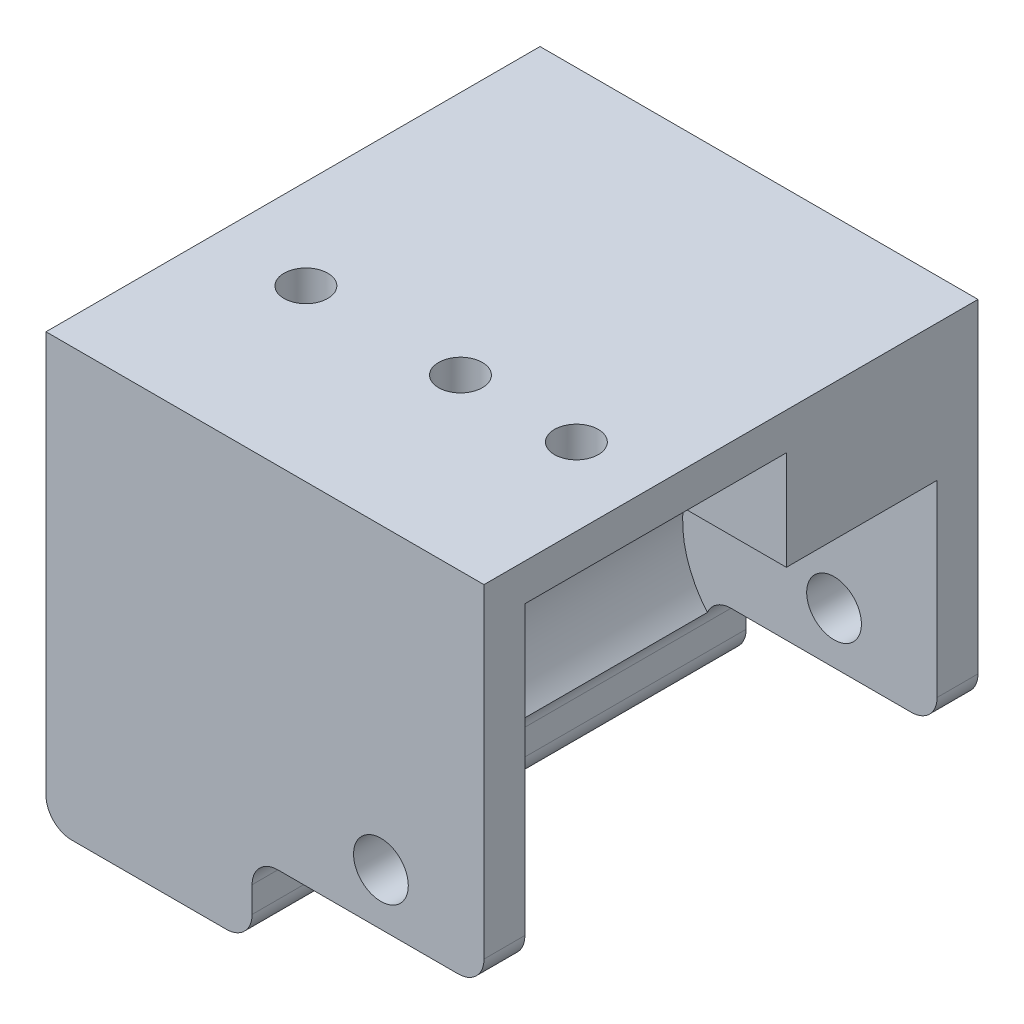
ISO-10303-21;
HEADER;
FILE_DESCRIPTION(('STEP AP214'),'2;1');
FILE_NAME('part.step','',(''),(''),'','','');
FILE_SCHEMA(('AUTOMOTIVE_DESIGN { 1 0 10303 214 1 1 1 1 }'));
ENDSEC;
DATA;
#1=APPLICATION_CONTEXT('core data for automotive mechanical design processes');
#2=APPLICATION_PROTOCOL_DEFINITION('international standard','automotive_design',2000,#1);
#3=PRODUCT_CONTEXT('',#1,'mechanical');
#4=PRODUCT('Part','Part','',(#3));
#5=PRODUCT_RELATED_PRODUCT_CATEGORY('part','',(#4));
#6=PRODUCT_DEFINITION_FORMATION('','',#4);
#7=PRODUCT_DEFINITION_CONTEXT('part definition',#1,'design');
#8=PRODUCT_DEFINITION('design','',#6,#7);
#9=PRODUCT_DEFINITION_SHAPE('','',#8);
#10=(LENGTH_UNIT() NAMED_UNIT(*) SI_UNIT(.MILLI.,.METRE.));
#11=(NAMED_UNIT(*) PLANE_ANGLE_UNIT() SI_UNIT($,.RADIAN.));
#12=(NAMED_UNIT(*) SI_UNIT($,.STERADIAN.) SOLID_ANGLE_UNIT());
#13=UNCERTAINTY_MEASURE_WITH_UNIT(LENGTH_MEASURE(1.E-05),#10,'distance_accuracy_value','');
#14=(GEOMETRIC_REPRESENTATION_CONTEXT(3) GLOBAL_UNCERTAINTY_ASSIGNED_CONTEXT((#13)) GLOBAL_UNIT_ASSIGNED_CONTEXT((#10,
#11,#12)) REPRESENTATION_CONTEXT('',''));
#15=CARTESIAN_POINT('',(0.,0.,0.));
#16=DIRECTION('',(0.,0.,1.));
#17=DIRECTION('',(1.,0.,0.));
#18=AXIS2_PLACEMENT_3D('',#15,#16,#17);
#19=CARTESIAN_POINT('',(0.,0.,-32.));
#20=DIRECTION('',(0.,0.,-1.));
#21=DIRECTION('',(1.,0.,0.));
#22=AXIS2_PLACEMENT_3D('',#19,#20,#21);
#23=PLANE('',#22);
#24=CARTESIAN_POINT('',(-8.,4.,-32.));
#25=DIRECTION('',(0.,0.,1.));
#26=DIRECTION('',(1.,0.,0.));
#27=AXIS2_PLACEMENT_3D('',#24,#25,#26);
#28=CIRCLE('',#27,2.125);
#29=CARTESIAN_POINT('',(-5.875,4.,-32.));
#30=VERTEX_POINT('',#29);
#31=EDGE_CURVE('E264',#30,#30,#28,.T.);
#32=ORIENTED_EDGE('',*,*,#31,.F.);
#33=EDGE_LOOP('',(#32));
#34=FACE_BOUND('',#33,.T.);
#35=DIRECTION('',(1.,0.,0.));
#36=VECTOR('',#35,1.);
#37=CARTESIAN_POINT('',(0.,0.,-32.));
#38=LINE('',#37,#36);
#39=CARTESIAN_POINT('',(-16.,0.,-32.));
#40=VERTEX_POINT('',#39);
#41=CARTESIAN_POINT('',(-2.,0.,-32.));
#42=VERTEX_POINT('',#41);
#43=EDGE_CURVE('E280',#40,#42,#38,.T.);
#44=ORIENTED_EDGE('',*,*,#43,.T.);
#45=CARTESIAN_POINT('',(-2.,2.,-32.));
#46=DIRECTION('',(0.,0.,-1.));
#47=DIRECTION('',(-1.,0.,0.));
#48=AXIS2_PLACEMENT_3D('',#45,#46,#47);
#49=CIRCLE('',#48,2.);
#50=CARTESIAN_POINT('',(0.,2.,-32.));
#51=VERTEX_POINT('',#50);
#52=EDGE_CURVE('E373',#42,#51,#49,.F.);
#53=ORIENTED_EDGE('',*,*,#52,.T.);
#54=DIRECTION('',(0.,1.,0.));
#55=VECTOR('',#54,1.);
#56=CARTESIAN_POINT('',(0.,0.,-32.));
#57=LINE('',#56,#55);
#58=CARTESIAN_POINT('',(0.,16.6,-32.));
#59=VERTEX_POINT('',#58);
#60=EDGE_CURVE('E271',#51,#59,#57,.T.);
#61=ORIENTED_EDGE('',*,*,#60,.T.);
#62=DIRECTION('',(1.,0.,0.));
#63=VECTOR('',#62,1.);
#64=CARTESIAN_POINT('',(-34.,16.6,-32.));
#65=LINE('',#64,#63);
#66=CARTESIAN_POINT('',(-18.,16.6,-32.));
#67=VERTEX_POINT('',#66);
#68=EDGE_CURVE('E200',#67,#59,#65,.T.);
#69=ORIENTED_EDGE('',*,*,#68,.F.);
#70=DIRECTION('',(0.,-1.,0.));
#71=VECTOR('',#70,1.);
#72=CARTESIAN_POINT('',(-18.,9.,-32.));
#73=LINE('',#72,#71);
#74=CARTESIAN_POINT('',(-18.,9.,-32.));
#75=VERTEX_POINT('',#74);
#76=EDGE_CURVE('E254',#67,#75,#73,.T.);
#77=ORIENTED_EDGE('',*,*,#76,.T.);
#78=CARTESIAN_POINT('',(-11.7550020016016,4.,-32.));
#79=DIRECTION('',(0.,0.,-1.));
#80=DIRECTION('',(-1.,0.,0.));
#81=AXIS2_PLACEMENT_3D('',#78,#79,#80);
#82=CIRCLE('',#81,8.);
#83=CARTESIAN_POINT('',(-17.8335182833445,-1.20111909232879,-32.));
#84=VERTEX_POINT('',#83);
#85=EDGE_CURVE('E63',#75,#84,#82,.F.);
#86=ORIENTED_EDGE('',*,*,#85,.T.);
#87=CARTESIAN_POINT('',(-16.,-2.,-32.));
#88=DIRECTION('',(0.,0.,-1.));
#89=DIRECTION('',(-1.,0.,0.));
#90=AXIS2_PLACEMENT_3D('',#87,#88,#89);
#91=CIRCLE('',#90,2.);
#92=EDGE_CURVE('E420',#84,#40,#91,.T.);
#93=ORIENTED_EDGE('',*,*,#92,.T.);
#94=EDGE_LOOP('',(#44,#53,#61,#69,#77,#86,#93));
#95=FACE_BOUND('',#94,.T.);
#96=ADVANCED_FACE('F45',(#34,#95),#23,.F.);
#97=CARTESIAN_POINT('',(0.,0.,0.));
#98=DIRECTION('',(0.,0.,1.));
#99=DIRECTION('',(1.,0.,0.));
#100=AXIS2_PLACEMENT_3D('',#97,#98,#99);
#101=PLANE('',#100);
#102=CARTESIAN_POINT('',(-8.,4.,0.));
#103=DIRECTION('',(0.,0.,1.));
#104=DIRECTION('',(1.,0.,0.));
#105=AXIS2_PLACEMENT_3D('',#102,#103,#104);
#106=CIRCLE('',#105,2.125);
#107=CARTESIAN_POINT('',(-5.875,4.,0.));
#108=VERTEX_POINT('',#107);
#109=EDGE_CURVE('E315',#108,#108,#106,.T.);
#110=ORIENTED_EDGE('',*,*,#109,.T.);
#111=EDGE_LOOP('',(#110));
#112=FACE_BOUND('',#111,.T.);
#113=DIRECTION('',(0.,1.,0.));
#114=VECTOR('',#113,1.);
#115=CARTESIAN_POINT('',(0.,0.,0.));
#116=LINE('',#115,#114);
#117=CARTESIAN_POINT('',(0.,2.,0.));
#118=VERTEX_POINT('',#117);
#119=CARTESIAN_POINT('',(0.,24.3,0.));
#120=VERTEX_POINT('',#119);
#121=EDGE_CURVE('E320',#118,#120,#116,.T.);
#122=ORIENTED_EDGE('',*,*,#121,.F.);
#123=CARTESIAN_POINT('',(-2.,2.,0.));
#124=DIRECTION('',(0.,0.,1.));
#125=DIRECTION('',(1.,0.,0.));
#126=AXIS2_PLACEMENT_3D('',#123,#124,#125);
#127=CIRCLE('',#126,2.);
#128=CARTESIAN_POINT('',(-2.,0.,0.));
#129=VERTEX_POINT('',#128);
#130=EDGE_CURVE('E392',#118,#129,#127,.F.);
#131=ORIENTED_EDGE('',*,*,#130,.T.);
#132=DIRECTION('',(1.,0.,0.));
#133=VECTOR('',#132,1.);
#134=CARTESIAN_POINT('',(0.,0.,0.));
#135=LINE('',#134,#133);
#136=CARTESIAN_POINT('',(-16.,0.,0.));
#137=VERTEX_POINT('',#136);
#138=EDGE_CURVE('E328',#137,#129,#135,.T.);
#139=ORIENTED_EDGE('',*,*,#138,.F.);
#140=CARTESIAN_POINT('',(-16.,-2.,0.));
#141=DIRECTION('',(0.,0.,1.));
#142=DIRECTION('',(1.,0.,0.));
#143=AXIS2_PLACEMENT_3D('',#140,#141,#142);
#144=CIRCLE('',#143,2.);
#145=CARTESIAN_POINT('',(-17.8335182833445,-1.20111909232879,0.));
#146=VERTEX_POINT('',#145);
#147=EDGE_CURVE('E414',#137,#146,#144,.T.);
#148=ORIENTED_EDGE('',*,*,#147,.T.);
#149=CARTESIAN_POINT('',(-11.7550020016016,4.,0.));
#150=DIRECTION('',(0.,0.,1.));
#151=DIRECTION('',(-1.,0.,0.));
#152=AXIS2_PLACEMENT_3D('',#149,#150,#151);
#153=CIRCLE('',#152,8.);
#154=CARTESIAN_POINT('',(-18.,9.,0.));
#155=VERTEX_POINT('',#154);
#156=EDGE_CURVE('E70',#155,#146,#153,.T.);
#157=ORIENTED_EDGE('',*,*,#156,.F.);
#158=DIRECTION('',(0.,-1.,0.));
#159=VECTOR('',#158,1.);
#160=CARTESIAN_POINT('',(-18.,9.,0.));
#161=LINE('',#160,#159);
#162=CARTESIAN_POINT('',(-18.,16.6,0.));
#163=VERTEX_POINT('',#162);
#164=EDGE_CURVE('E245',#163,#155,#161,.T.);
#165=ORIENTED_EDGE('',*,*,#164,.F.);
#166=DIRECTION('',(1.,0.,0.));
#167=VECTOR('',#166,1.);
#168=CARTESIAN_POINT('',(-18.,16.6,0.));
#169=LINE('',#168,#167);
#170=CARTESIAN_POINT('',(-34.,16.6,0.));
#171=VERTEX_POINT('',#170);
#172=EDGE_CURVE('E241',#171,#163,#169,.T.);
#173=ORIENTED_EDGE('',*,*,#172,.F.);
#174=DIRECTION('',(0.,-1.,0.));
#175=VECTOR('',#174,1.);
#176=CARTESIAN_POINT('',(-34.,0.,0.));
#177=LINE('',#176,#175);
#178=CARTESIAN_POINT('',(-34.,24.3,0.));
#179=VERTEX_POINT('',#178);
#180=EDGE_CURVE('E347',#179,#171,#177,.T.);
#181=ORIENTED_EDGE('',*,*,#180,.F.);
#182=DIRECTION('',(-1.,0.,0.));
#183=VECTOR('',#182,1.);
#184=CARTESIAN_POINT('',(0.,24.3,0.));
#185=LINE('',#184,#183);
#186=EDGE_CURVE('E216',#120,#179,#185,.T.);
#187=ORIENTED_EDGE('',*,*,#186,.F.);
#188=EDGE_LOOP('',(#122,#131,#139,#148,#157,#165,#173,#181,#187));
#189=FACE_BOUND('',#188,.T.);
#190=ADVANCED_FACE('F500',(#112,#189),#101,.F.);
#191=CARTESIAN_POINT('',(0.,0.,3.175));
#192=DIRECTION('',(0.,0.,1.));
#193=DIRECTION('',(1.,0.,0.));
#194=AXIS2_PLACEMENT_3D('',#191,#192,#193);
#195=PLANE('',#194);
#196=DIRECTION('',(1.,0.,0.));
#197=VECTOR('',#196,1.);
#198=CARTESIAN_POINT('',(0.,0.,3.175));
#199=LINE('',#198,#197);
#200=CARTESIAN_POINT('',(-16.,0.,3.175));
#201=VERTEX_POINT('',#200);
#202=CARTESIAN_POINT('',(-2.,0.,3.175));
#203=VERTEX_POINT('',#202);
#204=EDGE_CURVE('E340',#201,#203,#199,.T.);
#205=ORIENTED_EDGE('',*,*,#204,.T.);
#206=CARTESIAN_POINT('',(-2.,2.,3.175));
#207=DIRECTION('',(0.,0.,1.));
#208=DIRECTION('',(1.,0.,0.));
#209=AXIS2_PLACEMENT_3D('',#206,#207,#208);
#210=CIRCLE('',#209,2.);
#211=CARTESIAN_POINT('',(0.,2.,3.175));
#212=VERTEX_POINT('',#211);
#213=EDGE_CURVE('E401',#203,#212,#210,.T.);
#214=ORIENTED_EDGE('',*,*,#213,.T.);
#215=DIRECTION('',(0.,1.,0.));
#216=VECTOR('',#215,1.);
#217=CARTESIAN_POINT('',(0.,0.,3.175));
#218=LINE('',#217,#216);
#219=CARTESIAN_POINT('',(0.,27.175,3.175));
#220=VERTEX_POINT('',#219);
#221=EDGE_CURVE('E324',#212,#220,#218,.T.);
#222=ORIENTED_EDGE('',*,*,#221,.T.);
#223=DIRECTION('',(1.,0.,0.));
#224=VECTOR('',#223,1.);
#225=CARTESIAN_POINT('',(-34.,27.175,3.175));
#226=LINE('',#225,#224);
#227=CARTESIAN_POINT('',(-34.,27.175,3.175));
#228=VERTEX_POINT('',#227);
#229=EDGE_CURVE('E297',#228,#220,#226,.T.);
#230=ORIENTED_EDGE('',*,*,#229,.F.);
#231=DIRECTION('',(0.,-1.,0.));
#232=VECTOR('',#231,1.);
#233=CARTESIAN_POINT('',(-34.,0.,3.175));
#234=LINE('',#233,#232);
#235=CARTESIAN_POINT('',(-34.,-4.,3.175));
#236=VERTEX_POINT('',#235);
#237=EDGE_CURVE('E327',#228,#236,#234,.T.);
#238=ORIENTED_EDGE('',*,*,#237,.T.);
#239=CARTESIAN_POINT('',(-32.,-4.,3.175));
#240=DIRECTION('',(0.,0.,1.));
#241=DIRECTION('',(1.,0.,0.));
#242=AXIS2_PLACEMENT_3D('',#239,#240,#241);
#243=CIRCLE('',#242,2.);
#244=CARTESIAN_POINT('',(-32.,-6.,3.175));
#245=VERTEX_POINT('',#244);
#246=EDGE_CURVE('E398',#236,#245,#243,.T.);
#247=ORIENTED_EDGE('',*,*,#246,.T.);
#248=DIRECTION('',(1.,0.,0.));
#249=VECTOR('',#248,1.);
#250=CARTESIAN_POINT('',(-34.,-6.,3.175));
#251=LINE('',#250,#249);
#252=CARTESIAN_POINT('',(-20.,-6.,3.175));
#253=VERTEX_POINT('',#252);
#254=EDGE_CURVE('E332',#245,#253,#251,.T.);
#255=ORIENTED_EDGE('',*,*,#254,.T.);
#256=CARTESIAN_POINT('',(-20.,-4.,3.175));
#257=DIRECTION('',(0.,0.,1.));
#258=DIRECTION('',(1.,0.,0.));
#259=AXIS2_PLACEMENT_3D('',#256,#257,#258);
#260=CIRCLE('',#259,2.);
#261=CARTESIAN_POINT('',(-18.,-4.,3.175));
#262=VERTEX_POINT('',#261);
#263=EDGE_CURVE('E395',#253,#262,#260,.T.);
#264=ORIENTED_EDGE('',*,*,#263,.T.);
#265=DIRECTION('',(0.,1.,0.));
#266=VECTOR('',#265,1.);
#267=CARTESIAN_POINT('',(-18.,0.,3.175));
#268=LINE('',#267,#266);
#269=CARTESIAN_POINT('',(-18.,-2.,3.175));
#270=VERTEX_POINT('',#269);
#271=EDGE_CURVE('E336',#262,#270,#268,.T.);
#272=ORIENTED_EDGE('',*,*,#271,.T.);
#273=CARTESIAN_POINT('',(-16.,-2.,3.175));
#274=DIRECTION('',(0.,0.,1.));
#275=DIRECTION('',(1.,0.,0.));
#276=AXIS2_PLACEMENT_3D('',#273,#274,#275);
#277=CIRCLE('',#276,2.);
#278=EDGE_CURVE('E11',#270,#201,#277,.F.);
#279=ORIENTED_EDGE('',*,*,#278,.T.);
#280=EDGE_LOOP('',(#205,#214,#222,#230,#238,#247,#255,#264,#272,#279));
#281=FACE_BOUND('',#280,.T.);
#282=CARTESIAN_POINT('',(-8.,4.,3.175));
#283=DIRECTION('',(0.,0.,1.));
#284=DIRECTION('',(1.,0.,0.));
#285=AXIS2_PLACEMENT_3D('',#282,#283,#284);
#286=CIRCLE('',#285,2.125);
#287=CARTESIAN_POINT('',(-5.875,4.,3.175));
#288=VERTEX_POINT('',#287);
#289=EDGE_CURVE('E316',#288,#288,#286,.T.);
#290=ORIENTED_EDGE('',*,*,#289,.F.);
#291=EDGE_LOOP('',(#290));
#292=FACE_BOUND('',#291,.T.);
#293=ADVANCED_FACE('F486',(#281,#292),#195,.T.);
#294=CARTESIAN_POINT('',(0.,0.,3.175));
#295=DIRECTION('',(-1.,0.,0.));
#296=DIRECTION('',(0.,0.,1.));
#297=AXIS2_PLACEMENT_3D('',#294,#295,#296);
#298=PLANE('',#297);
#299=ORIENTED_EDGE('',*,*,#121,.T.);
#300=DIRECTION('',(0.,0.,1.));
#301=VECTOR('',#300,1.);
#302=CARTESIAN_POINT('',(0.,24.3,-20.3));
#303=LINE('',#302,#301);
#304=CARTESIAN_POINT('',(0.,24.3,-20.3));
#305=VERTEX_POINT('',#304);
#306=EDGE_CURVE('E211',#305,#120,#303,.T.);
#307=ORIENTED_EDGE('',*,*,#306,.F.);
#308=DIRECTION('',(0.,1.,0.));
#309=VECTOR('',#308,1.);
#310=CARTESIAN_POINT('',(0.,24.,-20.3));
#311=LINE('',#310,#309);
#312=CARTESIAN_POINT('',(0.,16.6,-20.3));
#313=VERTEX_POINT('',#312);
#314=EDGE_CURVE('E206',#313,#305,#311,.T.);
#315=ORIENTED_EDGE('',*,*,#314,.F.);
#316=DIRECTION('',(0.,0.,-1.));
#317=VECTOR('',#316,1.);
#318=CARTESIAN_POINT('',(0.,16.6,-20.3));
#319=LINE('',#318,#317);
#320=EDGE_CURVE('E234',#313,#59,#319,.T.);
#321=ORIENTED_EDGE('',*,*,#320,.T.);
#322=ORIENTED_EDGE('',*,*,#60,.F.);
#323=DIRECTION('',(0.,0.,1.));
#324=VECTOR('',#323,1.);
#325=CARTESIAN_POINT('',(0.,2.,-35.175));
#326=LINE('',#325,#324);
#327=CARTESIAN_POINT('',(0.,2.,-35.175));
#328=VERTEX_POINT('',#327);
#329=EDGE_CURVE('E380',#51,#328,#326,.F.);
#330=ORIENTED_EDGE('',*,*,#329,.T.);
#331=DIRECTION('',(0.,-1.,0.));
#332=VECTOR('',#331,1.);
#333=CARTESIAN_POINT('',(0.,27.175,-35.175));
#334=LINE('',#333,#332);
#335=CARTESIAN_POINT('',(0.,27.175,-35.175));
#336=VERTEX_POINT('',#335);
#337=EDGE_CURVE('E311',#336,#328,#334,.T.);
#338=ORIENTED_EDGE('',*,*,#337,.F.);
#339=DIRECTION('',(0.,0.,-1.));
#340=VECTOR('',#339,1.);
#341=CARTESIAN_POINT('',(0.,27.175,3.175));
#342=LINE('',#341,#340);
#343=EDGE_CURVE('E301',#220,#336,#342,.T.);
#344=ORIENTED_EDGE('',*,*,#343,.F.);
#345=ORIENTED_EDGE('',*,*,#221,.F.);
#346=DIRECTION('',(0.,0.,-1.));
#347=VECTOR('',#346,1.);
#348=CARTESIAN_POINT('',(0.,2.,3.175));
#349=LINE('',#348,#347);
#350=EDGE_CURVE('E376',#212,#118,#349,.T.);
#351=ORIENTED_EDGE('',*,*,#350,.T.);
#352=EDGE_LOOP('',(#299,#307,#315,#321,#322,#330,#338,#344,#345,#351));
#353=FACE_BOUND('',#352,.T.);
#354=ADVANCED_FACE('F492',(#353),#298,.F.);
#355=CARTESIAN_POINT('',(-34.,0.,3.175));
#356=DIRECTION('',(1.,0.,0.));
#357=DIRECTION('',(0.,0.,-1.));
#358=AXIS2_PLACEMENT_3D('',#355,#356,#357);
#359=PLANE('',#358);
#360=DIRECTION('',(0.,0.,-1.));
#361=VECTOR('',#360,1.);
#362=CARTESIAN_POINT('',(-34.,24.3,0.));
#363=LINE('',#362,#361);
#364=CARTESIAN_POINT('',(-34.,24.3,-20.3));
#365=VERTEX_POINT('',#364);
#366=EDGE_CURVE('E193',#179,#365,#363,.T.);
#367=ORIENTED_EDGE('',*,*,#366,.F.);
#368=ORIENTED_EDGE('',*,*,#180,.T.);
#369=DIRECTION('',(0.,0.,1.));
#370=VECTOR('',#369,1.);
#371=CARTESIAN_POINT('',(-34.,16.6,-35.177));
#372=LINE('',#371,#370);
#373=CARTESIAN_POINT('',(-34.,16.6,-20.3));
#374=VERTEX_POINT('',#373);
#375=EDGE_CURVE('E194',#374,#171,#372,.T.);
#376=ORIENTED_EDGE('',*,*,#375,.F.);
#377=DIRECTION('',(0.,-1.,0.));
#378=VECTOR('',#377,1.);
#379=CARTESIAN_POINT('',(-34.,24.,-20.3));
#380=LINE('',#379,#378);
#381=EDGE_CURVE('E187',#365,#374,#380,.T.);
#382=ORIENTED_EDGE('',*,*,#381,.F.);
#383=EDGE_LOOP('',(#367,#368,#376,#382));
#384=FACE_BOUND('',#383,.T.);
#385=DIRECTION('',(0.,-1.,0.));
#386=VECTOR('',#385,1.);
#387=CARTESIAN_POINT('',(-34.,27.175,-35.175));
#388=LINE('',#387,#386);
#389=CARTESIAN_POINT('',(-34.,27.175,-35.175));
#390=VERTEX_POINT('',#389);
#391=CARTESIAN_POINT('',(-34.,-4.,-35.175));
#392=VERTEX_POINT('',#391);
#393=EDGE_CURVE('E307',#390,#392,#388,.T.);
#394=ORIENTED_EDGE('',*,*,#393,.T.);
#395=DIRECTION('',(0.,0.,-1.));
#396=VECTOR('',#395,1.);
#397=CARTESIAN_POINT('',(-34.,-4.,3.175));
#398=LINE('',#397,#396);
#399=EDGE_CURVE('E411',#392,#236,#398,.F.);
#400=ORIENTED_EDGE('',*,*,#399,.T.);
#401=ORIENTED_EDGE('',*,*,#237,.F.);
#402=DIRECTION('',(0.,0.,1.));
#403=VECTOR('',#402,1.);
#404=CARTESIAN_POINT('',(-34.,27.175,3.175));
#405=LINE('',#404,#403);
#406=EDGE_CURVE('E288',#390,#228,#405,.T.);
#407=ORIENTED_EDGE('',*,*,#406,.F.);
#408=EDGE_LOOP('',(#394,#400,#401,#407));
#409=FACE_BOUND('',#408,.T.);
#410=ADVANCED_FACE('F189',(#384,#409),#359,.F.);
#411=CARTESIAN_POINT('',(-34.,-6.,3.175));
#412=DIRECTION('',(0.,1.,0.));
#413=DIRECTION('',(0.,0.,1.));
#414=AXIS2_PLACEMENT_3D('',#411,#412,#413);
#415=PLANE('',#414);
#416=CARTESIAN_POINT('',(-27.,-6.00000000000001,-9.99999999999999));
#417=DIRECTION('',(0.,1.,0.));
#418=DIRECTION('',(-1.,0.,0.));
#419=AXIS2_PLACEMENT_3D('',#416,#417,#418);
#420=CIRCLE('',#419,1.7);
#421=CARTESIAN_POINT('',(-28.7,-6.00000000000001,-9.99999999999999));
#422=VERTEX_POINT('',#421);
#423=EDGE_CURVE('E462',#422,#422,#420,.T.);
#424=ORIENTED_EDGE('',*,*,#423,.T.);
#425=EDGE_LOOP('',(#424));
#426=FACE_BOUND('',#425,.T.);
#427=ORIENTED_EDGE('',*,*,#254,.F.);
#428=DIRECTION('',(0.,0.,-1.));
#429=VECTOR('',#428,1.);
#430=CARTESIAN_POINT('',(-32.,-6.,3.175));
#431=LINE('',#430,#429);
#432=CARTESIAN_POINT('',(-32.,-6.,-35.175));
#433=VERTEX_POINT('',#432);
#434=EDGE_CURVE('E407',#245,#433,#431,.T.);
#435=ORIENTED_EDGE('',*,*,#434,.T.);
#436=DIRECTION('',(1.,0.,0.));
#437=VECTOR('',#436,1.);
#438=CARTESIAN_POINT('',(-34.,-6.,-35.175));
#439=LINE('',#438,#437);
#440=CARTESIAN_POINT('',(-20.,-6.,-35.175));
#441=VERTEX_POINT('',#440);
#442=EDGE_CURVE('E284',#433,#441,#439,.T.);
#443=ORIENTED_EDGE('',*,*,#442,.T.);
#444=DIRECTION('',(0.,0.,-1.));
#445=VECTOR('',#444,1.);
#446=CARTESIAN_POINT('',(-20.,-6.,3.175));
#447=LINE('',#446,#445);
#448=EDGE_CURVE('E404',#441,#253,#447,.F.);
#449=ORIENTED_EDGE('',*,*,#448,.T.);
#450=EDGE_LOOP('',(#427,#435,#443,#449));
#451=FACE_BOUND('',#450,.T.);
#452=ADVANCED_FACE('F550',(#426,#451),#415,.F.);
#453=CARTESIAN_POINT('',(-18.,0.,3.175));
#454=DIRECTION('',(-1.,0.,0.));
#455=DIRECTION('',(0.,0.,1.));
#456=AXIS2_PLACEMENT_3D('',#453,#454,#455);
#457=PLANE('',#456);
#458=DIRECTION('',(0.,1.,0.));
#459=VECTOR('',#458,1.);
#460=CARTESIAN_POINT('',(-18.,0.,-35.175));
#461=LINE('',#460,#459);
#462=CARTESIAN_POINT('',(-18.,-4.,-35.175));
#463=VERTEX_POINT('',#462);
#464=CARTESIAN_POINT('',(-18.,-2.,-35.175));
#465=VERTEX_POINT('',#464);
#466=EDGE_CURVE('E279',#463,#465,#461,.T.);
#467=ORIENTED_EDGE('',*,*,#466,.T.);
#468=DIRECTION('',(0.,0.,-1.));
#469=VECTOR('',#468,1.);
#470=CARTESIAN_POINT('',(-18.,-2.,3.175));
#471=LINE('',#470,#469);
#472=EDGE_CURVE('E370',#465,#270,#471,.F.);
#473=ORIENTED_EDGE('',*,*,#472,.T.);
#474=ORIENTED_EDGE('',*,*,#271,.F.);
#475=DIRECTION('',(0.,0.,-1.));
#476=VECTOR('',#475,1.);
#477=CARTESIAN_POINT('',(-18.,-4.,3.175));
#478=LINE('',#477,#476);
#479=EDGE_CURVE('E366',#262,#463,#478,.T.);
#480=ORIENTED_EDGE('',*,*,#479,.T.);
#481=EDGE_LOOP('',(#467,#473,#474,#480));
#482=FACE_BOUND('',#481,.T.);
#483=ADVANCED_FACE('F541',(#482),#457,.F.);
#484=CARTESIAN_POINT('',(0.,0.,3.175));
#485=DIRECTION('',(0.,1.,0.));
#486=DIRECTION('',(-1.,0.,0.));
#487=AXIS2_PLACEMENT_3D('',#484,#485,#486);
#488=PLANE('',#487);
#489=ORIENTED_EDGE('',*,*,#204,.F.);
#490=DIRECTION('',(0.,0.,-1.));
#491=VECTOR('',#490,1.);
#492=CARTESIAN_POINT('',(-16.,0.,0.));
#493=LINE('',#492,#491);
#494=EDGE_CURVE('E355',#201,#137,#493,.T.);
#495=ORIENTED_EDGE('',*,*,#494,.T.);
#496=ORIENTED_EDGE('',*,*,#138,.T.);
#497=DIRECTION('',(0.,0.,-1.));
#498=VECTOR('',#497,1.);
#499=CARTESIAN_POINT('',(-2.,0.,3.175));
#500=LINE('',#499,#498);
#501=EDGE_CURVE('E344',#129,#203,#500,.F.);
#502=ORIENTED_EDGE('',*,*,#501,.T.);
#503=EDGE_LOOP('',(#489,#495,#496,#502));
#504=FACE_BOUND('',#503,.T.);
#505=ADVANCED_FACE('F503',(#504),#488,.F.);
#506=CARTESIAN_POINT('',(-8.,4.,3.175));
#507=DIRECTION('',(0.,0.,-1.));
#508=DIRECTION('',(-1.,0.,0.));
#509=AXIS2_PLACEMENT_3D('',#506,#507,#508);
#510=CYLINDRICAL_SURFACE('',#509,2.125);
#511=ORIENTED_EDGE('',*,*,#289,.T.);
#512=EDGE_LOOP('',(#511));
#513=FACE_BOUND('',#512,.T.);
#514=ORIENTED_EDGE('',*,*,#109,.F.);
#515=EDGE_LOOP('',(#514));
#516=FACE_BOUND('',#515,.T.);
#517=ADVANCED_FACE('F579',(#513,#516),#510,.F.);
#518=CARTESIAN_POINT('',(-34.,27.175,-35.175));
#519=DIRECTION('',(0.,0.,1.));
#520=DIRECTION('',(1.,0.,0.));
#521=AXIS2_PLACEMENT_3D('',#518,#519,#520);
#522=PLANE('',#521);
#523=ORIENTED_EDGE('',*,*,#337,.T.);
#524=CARTESIAN_POINT('',(-2.,2.,-35.175));
#525=DIRECTION('',(0.,0.,1.));
#526=DIRECTION('',(1.,0.,0.));
#527=AXIS2_PLACEMENT_3D('',#524,#525,#526);
#528=CIRCLE('',#527,2.);
#529=CARTESIAN_POINT('',(-2.,0.,-35.175));
#530=VERTEX_POINT('',#529);
#531=EDGE_CURVE('E389',#328,#530,#528,.F.);
#532=ORIENTED_EDGE('',*,*,#531,.T.);
#533=DIRECTION('',(1.,0.,0.));
#534=VECTOR('',#533,1.);
#535=CARTESIAN_POINT('',(0.,0.,-35.175));
#536=LINE('',#535,#534);
#537=CARTESIAN_POINT('',(-16.,0.,-35.175));
#538=VERTEX_POINT('',#537);
#539=EDGE_CURVE('E275',#538,#530,#536,.T.);
#540=ORIENTED_EDGE('',*,*,#539,.F.);
#541=CARTESIAN_POINT('',(-16.,-2.,-35.175));
#542=DIRECTION('',(0.,0.,1.));
#543=DIRECTION('',(1.,0.,0.));
#544=AXIS2_PLACEMENT_3D('',#541,#542,#543);
#545=CIRCLE('',#544,2.);
#546=EDGE_CURVE('E55',#538,#465,#545,.T.);
#547=ORIENTED_EDGE('',*,*,#546,.T.);
#548=ORIENTED_EDGE('',*,*,#466,.F.);
#549=CARTESIAN_POINT('',(-20.,-4.,-35.175));
#550=DIRECTION('',(0.,0.,1.));
#551=DIRECTION('',(1.,0.,0.));
#552=AXIS2_PLACEMENT_3D('',#549,#550,#551);
#553=CIRCLE('',#552,2.);
#554=EDGE_CURVE('E383',#463,#441,#553,.F.);
#555=ORIENTED_EDGE('',*,*,#554,.T.);
#556=ORIENTED_EDGE('',*,*,#442,.F.);
#557=CARTESIAN_POINT('',(-32.,-4.,-35.175));
#558=DIRECTION('',(0.,0.,1.));
#559=DIRECTION('',(1.,0.,0.));
#560=AXIS2_PLACEMENT_3D('',#557,#558,#559);
#561=CIRCLE('',#560,2.);
#562=EDGE_CURVE('E386',#433,#392,#561,.F.);
#563=ORIENTED_EDGE('',*,*,#562,.T.);
#564=ORIENTED_EDGE('',*,*,#393,.F.);
#565=DIRECTION('',(-1.,0.,0.));
#566=VECTOR('',#565,1.);
#567=CARTESIAN_POINT('',(-34.,27.175,-35.175));
#568=LINE('',#567,#566);
#569=EDGE_CURVE('E304',#336,#390,#568,.T.);
#570=ORIENTED_EDGE('',*,*,#569,.F.);
#571=EDGE_LOOP('',(#523,#532,#540,#547,#548,#555,#556,#563,#564,#570));
#572=FACE_BOUND('',#571,.T.);
#573=CARTESIAN_POINT('',(-8.,4.,-35.175));
#574=DIRECTION('',(0.,0.,1.));
#575=DIRECTION('',(1.,0.,0.));
#576=AXIS2_PLACEMENT_3D('',#573,#574,#575);
#577=CIRCLE('',#576,2.125);
#578=CARTESIAN_POINT('',(-5.875,4.,-35.175));
#579=VERTEX_POINT('',#578);
#580=EDGE_CURVE('E267',#579,#579,#577,.T.);
#581=ORIENTED_EDGE('',*,*,#580,.T.);
#582=EDGE_LOOP('',(#581));
#583=FACE_BOUND('',#582,.T.);
#584=ADVANCED_FACE('F474',(#572,#583),#522,.F.);
#585=CARTESIAN_POINT('',(0.,27.175,0.));
#586=DIRECTION('',(0.,-1.,0.));
#587=DIRECTION('',(1.,0.,0.));
#588=AXIS2_PLACEMENT_3D('',#585,#586,#587);
#589=PLANE('',#588);
#590=CARTESIAN_POINT('',(-27.,27.175,-9.99999999999999));
#591=DIRECTION('',(0.,1.,0.));
#592=DIRECTION('',(-1.,0.,0.));
#593=AXIS2_PLACEMENT_3D('',#590,#591,#592);
#594=CIRCLE('',#593,1.7);
#595=CARTESIAN_POINT('',(-28.7,27.175,-9.99999999999999));
#596=VERTEX_POINT('',#595);
#597=EDGE_CURVE('E459',#596,#596,#594,.T.);
#598=ORIENTED_EDGE('',*,*,#597,.F.);
#599=EDGE_LOOP('',(#598));
#600=FACE_BOUND('',#599,.T.);
#601=CARTESIAN_POINT('',(-6.,27.175,-9.99999999999999));
#602=DIRECTION('',(0.,1.,0.));
#603=DIRECTION('',(-1.,0.,0.));
#604=AXIS2_PLACEMENT_3D('',#601,#602,#603);
#605=CIRCLE('',#604,1.7);
#606=CARTESIAN_POINT('',(-7.7,27.175,-9.99999999999999));
#607=VERTEX_POINT('',#606);
#608=EDGE_CURVE('E456',#607,#607,#605,.T.);
#609=ORIENTED_EDGE('',*,*,#608,.F.);
#610=EDGE_LOOP('',(#609));
#611=FACE_BOUND('',#610,.T.);
#612=CARTESIAN_POINT('',(-15.,27.175,-10.));
#613=DIRECTION('',(0.,1.,0.));
#614=DIRECTION('',(-1.,0.,0.));
#615=AXIS2_PLACEMENT_3D('',#612,#613,#614);
#616=CIRCLE('',#615,1.7);
#617=CARTESIAN_POINT('',(-16.7,27.175,-10.));
#618=VERTEX_POINT('',#617);
#619=EDGE_CURVE('E429',#618,#618,#616,.T.);
#620=ORIENTED_EDGE('',*,*,#619,.F.);
#621=EDGE_LOOP('',(#620));
#622=FACE_BOUND('',#621,.T.);
#623=ORIENTED_EDGE('',*,*,#406,.T.);
#624=ORIENTED_EDGE('',*,*,#229,.T.);
#625=ORIENTED_EDGE('',*,*,#343,.T.);
#626=ORIENTED_EDGE('',*,*,#569,.T.);
#627=EDGE_LOOP('',(#623,#624,#625,#626));
#628=FACE_BOUND('',#627,.T.);
#629=ADVANCED_FACE('F470',(#600,#611,#622,#628),#589,.F.);
#630=CARTESIAN_POINT('',(0.,0.,-35.175));
#631=DIRECTION('',(0.,-1.,0.));
#632=DIRECTION('',(1.,0.,0.));
#633=AXIS2_PLACEMENT_3D('',#630,#631,#632);
#634=PLANE('',#633);
#635=ORIENTED_EDGE('',*,*,#43,.F.);
#636=DIRECTION('',(0.,0.,1.));
#637=VECTOR('',#636,1.);
#638=CARTESIAN_POINT('',(-16.,0.,-33.5875));
#639=LINE('',#638,#637);
#640=EDGE_CURVE('E363',#40,#538,#639,.F.);
#641=ORIENTED_EDGE('',*,*,#640,.T.);
#642=ORIENTED_EDGE('',*,*,#539,.T.);
#643=DIRECTION('',(0.,0.,1.));
#644=VECTOR('',#643,1.);
#645=CARTESIAN_POINT('',(-2.,0.,-32.));
#646=LINE('',#645,#644);
#647=EDGE_CURVE('E359',#530,#42,#646,.T.);
#648=ORIENTED_EDGE('',*,*,#647,.T.);
#649=EDGE_LOOP('',(#635,#641,#642,#648));
#650=FACE_BOUND('',#649,.T.);
#651=ADVANCED_FACE('F473',(#650),#634,.T.);
#652=CARTESIAN_POINT('',(-8.,4.,-35.175));
#653=DIRECTION('',(0.,0.,1.));
#654=DIRECTION('',(1.,0.,0.));
#655=AXIS2_PLACEMENT_3D('',#652,#653,#654);
#656=CYLINDRICAL_SURFACE('',#655,2.125);
#657=ORIENTED_EDGE('',*,*,#580,.F.);
#658=EDGE_LOOP('',(#657));
#659=FACE_BOUND('',#658,.T.);
#660=ORIENTED_EDGE('',*,*,#31,.T.);
#661=EDGE_LOOP('',(#660));
#662=FACE_BOUND('',#661,.T.);
#663=ADVANCED_FACE('F573',(#659,#662),#656,.F.);
#664=CARTESIAN_POINT('',(-18.,9.,-35.177));
#665=DIRECTION('',(-1.,0.,0.));
#666=DIRECTION('',(0.,0.,1.));
#667=AXIS2_PLACEMENT_3D('',#664,#665,#666);
#668=PLANE('',#667);
#669=ORIENTED_EDGE('',*,*,#76,.F.);
#670=DIRECTION('',(0.,0.,1.));
#671=VECTOR('',#670,1.);
#672=CARTESIAN_POINT('',(-18.,16.6,-35.177));
#673=LINE('',#672,#671);
#674=CARTESIAN_POINT('',(-18.,16.6,-20.3));
#675=VERTEX_POINT('',#674);
#676=EDGE_CURVE('E255',#67,#675,#673,.T.);
#677=ORIENTED_EDGE('',*,*,#676,.T.);
#678=EDGE_CURVE('E259',#675,#163,#673,.T.);
#679=ORIENTED_EDGE('',*,*,#678,.T.);
#680=ORIENTED_EDGE('',*,*,#164,.T.);
#681=DIRECTION('',(0.,0.,1.));
#682=VECTOR('',#681,1.);
#683=CARTESIAN_POINT('',(-18.,9.,-35.177));
#684=LINE('',#683,#682);
#685=EDGE_CURVE('E251',#75,#155,#684,.T.);
#686=ORIENTED_EDGE('',*,*,#685,.F.);
#687=EDGE_LOOP('',(#669,#677,#679,#680,#686));
#688=FACE_BOUND('',#687,.T.);
#689=ADVANCED_FACE('F516',(#688),#668,.F.);
#690=CARTESIAN_POINT('',(-18.,16.6,-35.177));
#691=DIRECTION('',(0.,-1.,0.));
#692=DIRECTION('',(0.,0.,-1.));
#693=AXIS2_PLACEMENT_3D('',#690,#691,#692);
#694=PLANE('',#693);
#695=CARTESIAN_POINT('',(-27.,16.6,-9.99999999999999));
#696=DIRECTION('',(0.,-1.,0.));
#697=DIRECTION('',(0.,0.,-1.));
#698=AXIS2_PLACEMENT_3D('',#695,#696,#697);
#699=CIRCLE('',#698,1.7);
#700=CARTESIAN_POINT('',(-27.,16.6,-11.7));
#701=VERTEX_POINT('',#700);
#702=EDGE_CURVE('E218',#701,#701,#699,.T.);
#703=ORIENTED_EDGE('',*,*,#702,.T.);
#704=EDGE_LOOP('',(#703));
#705=FACE_BOUND('',#704,.T.);
#706=ORIENTED_EDGE('',*,*,#678,.F.);
#707=DIRECTION('',(1.,0.,0.));
#708=VECTOR('',#707,1.);
#709=CARTESIAN_POINT('',(-34.,16.6,-20.3));
#710=LINE('',#709,#708);
#711=EDGE_CURVE('E229',#374,#675,#710,.T.);
#712=ORIENTED_EDGE('',*,*,#711,.F.);
#713=ORIENTED_EDGE('',*,*,#375,.T.);
#714=ORIENTED_EDGE('',*,*,#172,.T.);
#715=EDGE_LOOP('',(#706,#712,#713,#714));
#716=FACE_BOUND('',#715,.T.);
#717=ADVANCED_FACE('F520',(#705,#716),#694,.F.);
#718=CARTESIAN_POINT('',(-11.7550020016016,4.,-35.177));
#719=DIRECTION('',(0.,0.,1.));
#720=DIRECTION('',(1.,0.,0.));
#721=AXIS2_PLACEMENT_3D('',#718,#719,#720);
#722=CYLINDRICAL_SURFACE('',#721,8.);
#723=ORIENTED_EDGE('',*,*,#85,.F.);
#724=ORIENTED_EDGE('',*,*,#685,.T.);
#725=ORIENTED_EDGE('',*,*,#156,.T.);
#726=DIRECTION('',(0.,0.,1.));
#727=VECTOR('',#726,1.);
#728=CARTESIAN_POINT('',(-17.8335182833445,-1.20111909232879,0.));
#729=LINE('',#728,#727);
#730=EDGE_CURVE('E417',#146,#84,#729,.F.);
#731=ORIENTED_EDGE('',*,*,#730,.T.);
#732=EDGE_LOOP('',(#723,#724,#725,#731));
#733=FACE_BOUND('',#732,.T.);
#734=ADVANCED_FACE('F690',(#733),#722,.F.);
#735=CARTESIAN_POINT('',(-34.,16.6,-20.3));
#736=DIRECTION('',(0.,1.,0.));
#737=DIRECTION('',(0.,0.,1.));
#738=AXIS2_PLACEMENT_3D('',#735,#736,#737);
#739=PLANE('',#738);
#740=EDGE_CURVE('E199',#675,#313,#710,.T.);
#741=ORIENTED_EDGE('',*,*,#740,.F.);
#742=ORIENTED_EDGE('',*,*,#676,.F.);
#743=ORIENTED_EDGE('',*,*,#68,.T.);
#744=ORIENTED_EDGE('',*,*,#320,.F.);
#745=EDGE_LOOP('',(#741,#742,#743,#744));
#746=FACE_BOUND('',#745,.T.);
#747=ADVANCED_FACE('F524',(#746),#739,.F.);
#748=CARTESIAN_POINT('',(0.,0.,-20.3));
#749=DIRECTION('',(0.,0.,1.));
#750=DIRECTION('',(1.,0.,0.));
#751=AXIS2_PLACEMENT_3D('',#748,#749,#750);
#752=PLANE('',#751);
#753=ORIENTED_EDGE('',*,*,#381,.T.);
#754=ORIENTED_EDGE('',*,*,#711,.T.);
#755=ORIENTED_EDGE('',*,*,#740,.T.);
#756=ORIENTED_EDGE('',*,*,#314,.T.);
#757=DIRECTION('',(1.,0.,0.));
#758=VECTOR('',#757,1.);
#759=CARTESIAN_POINT('',(-34.,24.3,-20.3));
#760=LINE('',#759,#758);
#761=EDGE_CURVE('E203',#365,#305,#760,.T.);
#762=ORIENTED_EDGE('',*,*,#761,.F.);
#763=EDGE_LOOP('',(#753,#754,#755,#756,#762));
#764=FACE_BOUND('',#763,.T.);
#765=ADVANCED_FACE('F204',(#764),#752,.T.);
#766=CARTESIAN_POINT('',(-16.,-2.,3.175));
#767=DIRECTION('',(0.,0.,1.));
#768=DIRECTION('',(1.,0.,0.));
#769=AXIS2_PLACEMENT_3D('',#766,#767,#768);
#770=CYLINDRICAL_SURFACE('',#769,2.);
#771=ORIENTED_EDGE('',*,*,#278,.F.);
#772=ORIENTED_EDGE('',*,*,#472,.F.);
#773=ORIENTED_EDGE('',*,*,#546,.F.);
#774=ORIENTED_EDGE('',*,*,#640,.F.);
#775=ORIENTED_EDGE('',*,*,#92,.F.);
#776=ORIENTED_EDGE('',*,*,#730,.F.);
#777=ORIENTED_EDGE('',*,*,#147,.F.);
#778=ORIENTED_EDGE('',*,*,#494,.F.);
#779=EDGE_LOOP('',(#771,#772,#773,#774,#775,#776,#777,#778));
#780=FACE_BOUND('',#779,.T.);
#781=ADVANCED_FACE('F507',(#780),#770,.F.);
#782=CARTESIAN_POINT('',(-2.,2.,-35.175));
#783=DIRECTION('',(0.,0.,-1.));
#784=DIRECTION('',(-1.,0.,0.));
#785=AXIS2_PLACEMENT_3D('',#782,#783,#784);
#786=CYLINDRICAL_SURFACE('',#785,2.);
#787=ORIENTED_EDGE('',*,*,#531,.F.);
#788=ORIENTED_EDGE('',*,*,#329,.F.);
#789=ORIENTED_EDGE('',*,*,#52,.F.);
#790=ORIENTED_EDGE('',*,*,#647,.F.);
#791=EDGE_LOOP('',(#787,#788,#789,#790));
#792=FACE_BOUND('',#791,.T.);
#793=ADVANCED_FACE('F530',(#792),#786,.T.);
#794=CARTESIAN_POINT('',(-2.,2.,3.175));
#795=DIRECTION('',(0.,0.,-1.));
#796=DIRECTION('',(-1.,0.,0.));
#797=AXIS2_PLACEMENT_3D('',#794,#795,#796);
#798=CYLINDRICAL_SURFACE('',#797,2.);
#799=ORIENTED_EDGE('',*,*,#213,.F.);
#800=ORIENTED_EDGE('',*,*,#501,.F.);
#801=ORIENTED_EDGE('',*,*,#130,.F.);
#802=ORIENTED_EDGE('',*,*,#350,.F.);
#803=EDGE_LOOP('',(#799,#800,#801,#802));
#804=FACE_BOUND('',#803,.T.);
#805=ADVANCED_FACE('F496',(#804),#798,.T.);
#806=CARTESIAN_POINT('',(-32.,-4.,3.175));
#807=DIRECTION('',(0.,0.,-1.));
#808=DIRECTION('',(-1.,0.,0.));
#809=AXIS2_PLACEMENT_3D('',#806,#807,#808);
#810=CYLINDRICAL_SURFACE('',#809,2.);
#811=ORIENTED_EDGE('',*,*,#246,.F.);
#812=ORIENTED_EDGE('',*,*,#399,.F.);
#813=ORIENTED_EDGE('',*,*,#562,.F.);
#814=ORIENTED_EDGE('',*,*,#434,.F.);
#815=EDGE_LOOP('',(#811,#812,#813,#814));
#816=FACE_BOUND('',#815,.T.);
#817=ADVANCED_FACE('F553',(#816),#810,.T.);
#818=CARTESIAN_POINT('',(-20.,-4.,3.175));
#819=DIRECTION('',(0.,0.,-1.));
#820=DIRECTION('',(-1.,0.,0.));
#821=AXIS2_PLACEMENT_3D('',#818,#819,#820);
#822=CYLINDRICAL_SURFACE('',#821,2.);
#823=ORIENTED_EDGE('',*,*,#263,.F.);
#824=ORIENTED_EDGE('',*,*,#448,.F.);
#825=ORIENTED_EDGE('',*,*,#554,.F.);
#826=ORIENTED_EDGE('',*,*,#479,.F.);
#827=EDGE_LOOP('',(#823,#824,#825,#826));
#828=FACE_BOUND('',#827,.T.);
#829=ADVANCED_FACE('F47',(#828),#822,.T.);
#830=CARTESIAN_POINT('',(0.,24.3,0.));
#831=DIRECTION('',(0.,-1.,0.));
#832=DIRECTION('',(1.,0.,0.));
#833=AXIS2_PLACEMENT_3D('',#830,#831,#832);
#834=PLANE('',#833);
#835=CARTESIAN_POINT('',(-27.,24.3,-9.99999999999999));
#836=DIRECTION('',(0.,-1.,0.));
#837=DIRECTION('',(1.,0.,0.));
#838=AXIS2_PLACEMENT_3D('',#835,#836,#837);
#839=CIRCLE('',#838,1.7);
#840=CARTESIAN_POINT('',(-25.3,24.3,-9.99999999999999));
#841=VERTEX_POINT('',#840);
#842=EDGE_CURVE('E49',#841,#841,#839,.T.);
#843=ORIENTED_EDGE('',*,*,#842,.F.);
#844=EDGE_LOOP('',(#843));
#845=FACE_BOUND('',#844,.T.);
#846=CARTESIAN_POINT('',(-6.,24.3,-9.99999999999999));
#847=DIRECTION('',(0.,-1.,0.));
#848=DIRECTION('',(1.,0.,0.));
#849=AXIS2_PLACEMENT_3D('',#846,#847,#848);
#850=CIRCLE('',#849,1.7);
#851=CARTESIAN_POINT('',(-4.3,24.3,-9.99999999999999));
#852=VERTEX_POINT('',#851);
#853=EDGE_CURVE('E428',#852,#852,#850,.T.);
#854=ORIENTED_EDGE('',*,*,#853,.F.);
#855=EDGE_LOOP('',(#854));
#856=FACE_BOUND('',#855,.T.);
#857=CARTESIAN_POINT('',(-15.,24.3,-10.));
#858=DIRECTION('',(0.,-1.,0.));
#859=DIRECTION('',(1.,0.,0.));
#860=AXIS2_PLACEMENT_3D('',#857,#858,#859);
#861=CIRCLE('',#860,1.7);
#862=CARTESIAN_POINT('',(-13.3,24.3,-10.));
#863=VERTEX_POINT('',#862);
#864=EDGE_CURVE('E425',#863,#863,#861,.T.);
#865=ORIENTED_EDGE('',*,*,#864,.F.);
#866=EDGE_LOOP('',(#865));
#867=FACE_BOUND('',#866,.T.);
#868=ORIENTED_EDGE('',*,*,#366,.T.);
#869=ORIENTED_EDGE('',*,*,#761,.T.);
#870=ORIENTED_EDGE('',*,*,#306,.T.);
#871=ORIENTED_EDGE('',*,*,#186,.T.);
#872=EDGE_LOOP('',(#868,#869,#870,#871));
#873=FACE_BOUND('',#872,.T.);
#874=ADVANCED_FACE('F214',(#845,#856,#867,#873),#834,.T.);
#875=CARTESIAN_POINT('',(-15.,-6.,-10.));
#876=DIRECTION('',(0.,1.,0.));
#877=DIRECTION('',(-1.,0.,0.));
#878=AXIS2_PLACEMENT_3D('',#875,#876,#877);
#879=CYLINDRICAL_SURFACE('',#878,1.7);
#880=ORIENTED_EDGE('',*,*,#864,.T.);
#881=EDGE_LOOP('',(#880));
#882=FACE_BOUND('',#881,.T.);
#883=ORIENTED_EDGE('',*,*,#619,.T.);
#884=EDGE_LOOP('',(#883));
#885=FACE_BOUND('',#884,.T.);
#886=ADVANCED_FACE('F443',(#882,#885),#879,.F.);
#887=CARTESIAN_POINT('',(-6.,-6.,-9.99999999999999));
#888=DIRECTION('',(0.,1.,0.));
#889=DIRECTION('',(-1.,0.,0.));
#890=AXIS2_PLACEMENT_3D('',#887,#888,#889);
#891=CYLINDRICAL_SURFACE('',#890,1.7);
#892=ORIENTED_EDGE('',*,*,#853,.T.);
#893=EDGE_LOOP('',(#892));
#894=FACE_BOUND('',#893,.T.);
#895=ORIENTED_EDGE('',*,*,#608,.T.);
#896=EDGE_LOOP('',(#895));
#897=FACE_BOUND('',#896,.T.);
#898=ADVANCED_FACE('F450',(#894,#897),#891,.F.);
#899=CARTESIAN_POINT('',(-27.,-6.00000000000001,-9.99999999999999));
#900=DIRECTION('',(0.,1.,0.));
#901=DIRECTION('',(-1.,0.,0.));
#902=AXIS2_PLACEMENT_3D('',#899,#900,#901);
#903=CYLINDRICAL_SURFACE('',#902,1.7);
#904=ORIENTED_EDGE('',*,*,#842,.T.);
#905=EDGE_LOOP('',(#904));
#906=FACE_BOUND('',#905,.T.);
#907=ORIENTED_EDGE('',*,*,#597,.T.);
#908=EDGE_LOOP('',(#907));
#909=FACE_BOUND('',#908,.T.);
#910=ADVANCED_FACE('F438',(#906,#909),#903,.F.);
#911=ORIENTED_EDGE('',*,*,#423,.F.);
#912=EDGE_LOOP('',(#911));
#913=FACE_BOUND('',#912,.T.);
#914=ORIENTED_EDGE('',*,*,#702,.F.);
#915=EDGE_LOOP('',(#914));
#916=FACE_BOUND('',#915,.T.);
#917=ADVANCED_FACE('F675',(#913,#916),#903,.F.);
#918=CLOSED_SHELL('',(#96,#190,#293,#354,#410,#452,#483,#505,#517,#584,#629,#651,#663,#689,#717,
#734,#747,#765,#781,#793,#805,#817,#829,#874,#886,#898,#910,#917));
#919=MANIFOLD_SOLID_BREP('B2',#918);
#920=ADVANCED_BREP_SHAPE_REPRESENTATION('',(#18,#919),#14);
#921=SHAPE_DEFINITION_REPRESENTATION(#9,#920);
ENDSEC;
END-ISO-10303-21;
